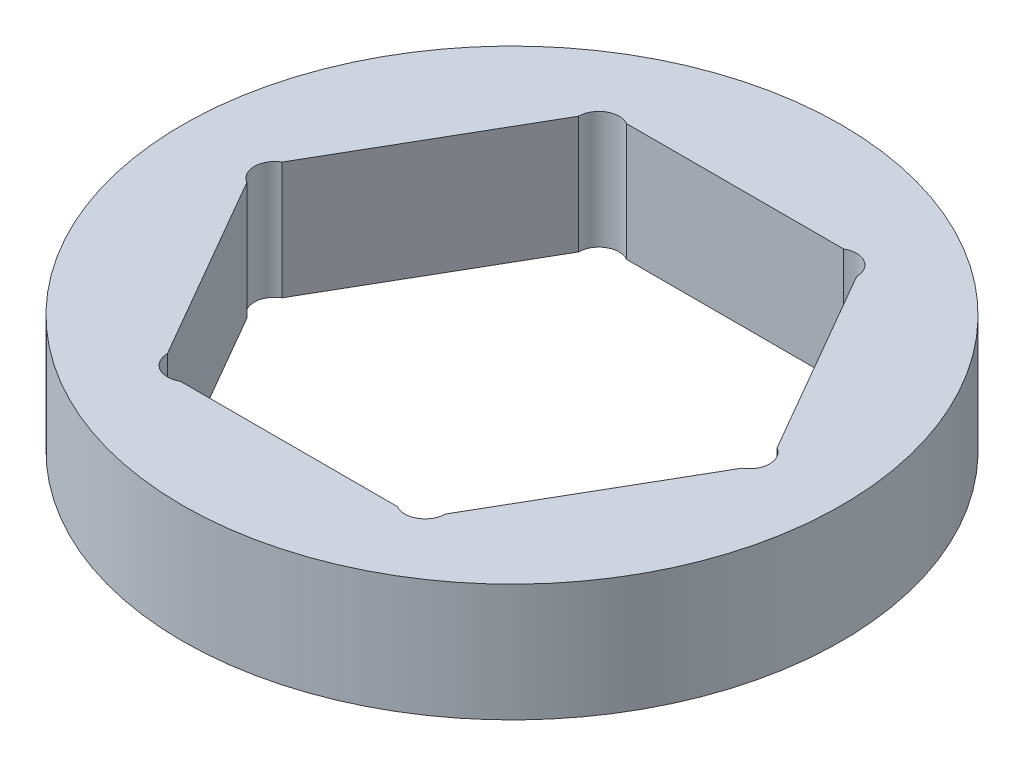
ISO-10303-21;
HEADER;
FILE_DESCRIPTION(('STEP AP214'),'2;1');
FILE_NAME('part.step','',(''),(''),'','','');
FILE_SCHEMA(('AUTOMOTIVE_DESIGN { 1 0 10303 214 1 1 1 1 }'));
ENDSEC;
DATA;
#1=APPLICATION_CONTEXT('core data for automotive mechanical design processes');
#2=APPLICATION_PROTOCOL_DEFINITION('international standard','automotive_design',2000,#1);
#3=PRODUCT_CONTEXT('',#1,'mechanical');
#4=PRODUCT('Part','Part','',(#3));
#5=PRODUCT_RELATED_PRODUCT_CATEGORY('part','',(#4));
#6=PRODUCT_DEFINITION_FORMATION('','',#4);
#7=PRODUCT_DEFINITION_CONTEXT('part definition',#1,'design');
#8=PRODUCT_DEFINITION('design','',#6,#7);
#9=PRODUCT_DEFINITION_SHAPE('','',#8);
#10=(LENGTH_UNIT() NAMED_UNIT(*) SI_UNIT(.MILLI.,.METRE.));
#11=(NAMED_UNIT(*) PLANE_ANGLE_UNIT() SI_UNIT($,.RADIAN.));
#12=(NAMED_UNIT(*) SI_UNIT($,.STERADIAN.) SOLID_ANGLE_UNIT());
#13=UNCERTAINTY_MEASURE_WITH_UNIT(LENGTH_MEASURE(1.E-05),#10,'distance_accuracy_value','');
#14=(GEOMETRIC_REPRESENTATION_CONTEXT(3) GLOBAL_UNCERTAINTY_ASSIGNED_CONTEXT((#13)) GLOBAL_UNIT_ASSIGNED_CONTEXT((#10,
#11,#12)) REPRESENTATION_CONTEXT('',''));
#15=CARTESIAN_POINT('',(0.,0.,0.));
#16=DIRECTION('',(0.,0.,1.));
#17=DIRECTION('',(1.,0.,0.));
#18=AXIS2_PLACEMENT_3D('',#15,#16,#17);
#19=CARTESIAN_POINT('',(-3.5128211777283,3.4798,-6.08438475772933));
#20=DIRECTION('',(0.,-1.,0.));
#21=DIRECTION('',(0.,0.,-1.));
#22=AXIS2_PLACEMENT_3D('',#19,#20,#21);
#23=CYLINDRICAL_SURFACE('',#22,0.600000000000001);
#24=CARTESIAN_POINT('',(-3.5128211777283,0.,-6.08438475772933));
#25=DIRECTION('',(0.,1.,0.));
#26=DIRECTION('',(0.,0.,1.));
#27=AXIS2_PLACEMENT_3D('',#24,#25,#26);
#28=CIRCLE('',#27,0.600000000000001);
#29=CARTESIAN_POINT('',(-3.2128211777283,0.,-6.604));
#30=VERTEX_POINT('',#29);
#31=CARTESIAN_POINT('',(-4.1128211777283,0.,-6.08438475772932));
#32=VERTEX_POINT('',#31);
#33=EDGE_CURVE('E162',#30,#32,#28,.T.);
#34=ORIENTED_EDGE('',*,*,#33,.F.);
#35=DIRECTION('',(0.,-1.,0.));
#36=VECTOR('',#35,1.);
#37=CARTESIAN_POINT('',(-3.2128211777283,3.4798,-6.604));
#38=LINE('',#37,#36);
#39=CARTESIAN_POINT('',(-3.2128211777283,3.4798,-6.604));
#40=VERTEX_POINT('',#39);
#41=EDGE_CURVE('E11',#40,#30,#38,.T.);
#42=ORIENTED_EDGE('',*,*,#41,.F.);
#43=CARTESIAN_POINT('',(-3.5128211777283,3.4798,-6.08438475772933));
#44=DIRECTION('',(0.,1.,0.));
#45=DIRECTION('',(0.,0.,1.));
#46=AXIS2_PLACEMENT_3D('',#43,#44,#45);
#47=CIRCLE('',#46,0.600000000000001);
#48=CARTESIAN_POINT('',(-4.1128211777283,3.4798,-6.08438475772932));
#49=VERTEX_POINT('',#48);
#50=EDGE_CURVE('E197',#40,#49,#47,.T.);
#51=ORIENTED_EDGE('',*,*,#50,.T.);
#52=DIRECTION('',(0.,-1.,0.));
#53=VECTOR('',#52,1.);
#54=CARTESIAN_POINT('',(-4.1128211777283,3.4798,-6.08438475772932));
#55=LINE('',#54,#53);
#56=EDGE_CURVE('E57',#49,#32,#55,.T.);
#57=ORIENTED_EDGE('',*,*,#56,.T.);
#58=EDGE_LOOP('',(#34,#42,#51,#57));
#59=FACE_BOUND('',#58,.T.);
#60=ADVANCED_FACE('F41',(#59),#23,.F.);
#61=CARTESIAN_POINT('',(0.,3.4798,-6.604));
#62=DIRECTION('',(0.,0.,1.));
#63=DIRECTION('',(1.,0.,0.));
#64=AXIS2_PLACEMENT_3D('',#61,#62,#63);
#65=PLANE('',#64);
#66=DIRECTION('',(-1.,0.,0.));
#67=VECTOR('',#66,1.);
#68=CARTESIAN_POINT('',(0.,0.,-6.604));
#69=LINE('',#68,#67);
#70=CARTESIAN_POINT('',(3.21282117772828,0.,-6.604));
#71=VERTEX_POINT('',#70);
#72=EDGE_CURVE('E164',#71,#30,#69,.T.);
#73=ORIENTED_EDGE('',*,*,#72,.F.);
#74=DIRECTION('',(0.,-1.,0.));
#75=VECTOR('',#74,1.);
#76=CARTESIAN_POINT('',(3.21282117772828,3.4798,-6.604));
#77=LINE('',#76,#75);
#78=CARTESIAN_POINT('',(3.21282117772828,3.4798,-6.604));
#79=VERTEX_POINT('',#78);
#80=EDGE_CURVE('E49',#79,#71,#77,.T.);
#81=ORIENTED_EDGE('',*,*,#80,.F.);
#82=DIRECTION('',(-1.,0.,0.));
#83=VECTOR('',#82,1.);
#84=CARTESIAN_POINT('',(0.,3.4798,-6.604));
#85=LINE('',#84,#83);
#86=EDGE_CURVE('E235',#79,#40,#85,.T.);
#87=ORIENTED_EDGE('',*,*,#86,.T.);
#88=ORIENTED_EDGE('',*,*,#41,.T.);
#89=EDGE_LOOP('',(#73,#81,#87,#88));
#90=FACE_BOUND('',#89,.T.);
#91=ADVANCED_FACE('F222',(#90),#65,.T.);
#92=CARTESIAN_POINT('',(3.51282117772829,3.4798,-6.08438475772934));
#93=DIRECTION('',(0.,-1.,0.));
#94=DIRECTION('',(0.,0.,-1.));
#95=AXIS2_PLACEMENT_3D('',#92,#93,#94);
#96=CYLINDRICAL_SURFACE('',#95,0.600000000000001);
#97=CARTESIAN_POINT('',(3.51282117772829,0.,-6.08438475772934));
#98=DIRECTION('',(0.,1.,0.));
#99=DIRECTION('',(0.,0.,1.));
#100=AXIS2_PLACEMENT_3D('',#97,#98,#99);
#101=CIRCLE('',#100,0.600000000000001);
#102=CARTESIAN_POINT('',(4.11282117772829,0.,-6.08438475772934));
#103=VERTEX_POINT('',#102);
#104=EDGE_CURVE('E167',#103,#71,#101,.T.);
#105=ORIENTED_EDGE('',*,*,#104,.F.);
#106=DIRECTION('',(0.,-1.,0.));
#107=VECTOR('',#106,1.);
#108=CARTESIAN_POINT('',(4.11282117772829,3.4798,-6.08438475772934));
#109=LINE('',#108,#107);
#110=CARTESIAN_POINT('',(4.11282117772829,3.4798,-6.08438475772934));
#111=VERTEX_POINT('',#110);
#112=EDGE_CURVE('E211',#111,#103,#109,.T.);
#113=ORIENTED_EDGE('',*,*,#112,.F.);
#114=CARTESIAN_POINT('',(3.51282117772829,3.4798,-6.08438475772934));
#115=DIRECTION('',(0.,1.,0.));
#116=DIRECTION('',(0.,0.,1.));
#117=AXIS2_PLACEMENT_3D('',#114,#115,#116);
#118=CIRCLE('',#117,0.600000000000001);
#119=EDGE_CURVE('E218',#111,#79,#118,.T.);
#120=ORIENTED_EDGE('',*,*,#119,.T.);
#121=ORIENTED_EDGE('',*,*,#80,.T.);
#122=EDGE_LOOP('',(#105,#113,#120,#121));
#123=FACE_BOUND('',#122,.T.);
#124=ADVANCED_FACE('F216',(#123),#96,.F.);
#125=CARTESIAN_POINT('',(5.71923176659243,3.4798,-3.302));
#126=DIRECTION('',(-0.866025403784438,0.,0.5));
#127=DIRECTION('',(0.5,0.,0.866025403784439));
#128=AXIS2_PLACEMENT_3D('',#125,#126,#127);
#129=PLANE('',#128);
#130=DIRECTION('',(-0.5,0.,-0.866025403784438));
#131=VECTOR('',#130,1.);
#132=CARTESIAN_POINT('',(5.71923176659243,0.,-3.302));
#133=LINE('',#132,#131);
#134=CARTESIAN_POINT('',(7.32564235545658,0.,-0.519615242270668));
#135=VERTEX_POINT('',#134);
#136=EDGE_CURVE('E170',#135,#103,#133,.T.);
#137=ORIENTED_EDGE('',*,*,#136,.F.);
#138=DIRECTION('',(0.,-1.,0.));
#139=VECTOR('',#138,1.);
#140=CARTESIAN_POINT('',(7.32564235545658,3.4798,-0.519615242270668));
#141=LINE('',#140,#139);
#142=CARTESIAN_POINT('',(7.32564235545658,3.4798,-0.519615242270668));
#143=VERTEX_POINT('',#142);
#144=EDGE_CURVE('E209',#143,#135,#141,.T.);
#145=ORIENTED_EDGE('',*,*,#144,.F.);
#146=DIRECTION('',(-0.5,0.,-0.866025403784438));
#147=VECTOR('',#146,1.);
#148=CARTESIAN_POINT('',(5.71923176659243,3.4798,-3.302));
#149=LINE('',#148,#147);
#150=EDGE_CURVE('E232',#143,#111,#149,.T.);
#151=ORIENTED_EDGE('',*,*,#150,.T.);
#152=ORIENTED_EDGE('',*,*,#112,.T.);
#153=EDGE_LOOP('',(#137,#145,#151,#152));
#154=FACE_BOUND('',#153,.T.);
#155=ADVANCED_FACE('F229',(#154),#129,.T.);
#156=CARTESIAN_POINT('',(7.02564235545658,3.4798,0.));
#157=DIRECTION('',(0.,-1.,0.));
#158=DIRECTION('',(0.,0.,-1.));
#159=AXIS2_PLACEMENT_3D('',#156,#157,#158);
#160=CYLINDRICAL_SURFACE('',#159,0.6);
#161=CARTESIAN_POINT('',(7.02564235545658,0.,0.));
#162=DIRECTION('',(0.,1.,0.));
#163=DIRECTION('',(0.,0.,1.));
#164=AXIS2_PLACEMENT_3D('',#161,#162,#163);
#165=CIRCLE('',#164,0.6);
#166=CARTESIAN_POINT('',(7.32564235545658,0.,0.519615242270659));
#167=VERTEX_POINT('',#166);
#168=EDGE_CURVE('E173',#167,#135,#165,.T.);
#169=ORIENTED_EDGE('',*,*,#168,.F.);
#170=DIRECTION('',(0.,-1.,0.));
#171=VECTOR('',#170,1.);
#172=CARTESIAN_POINT('',(7.32564235545658,3.4798,0.519615242270659));
#173=LINE('',#172,#171);
#174=CARTESIAN_POINT('',(7.32564235545658,3.4798,0.519615242270659));
#175=VERTEX_POINT('',#174);
#176=EDGE_CURVE('E207',#175,#167,#173,.T.);
#177=ORIENTED_EDGE('',*,*,#176,.F.);
#178=CARTESIAN_POINT('',(7.02564235545658,3.4798,0.));
#179=DIRECTION('',(0.,1.,0.));
#180=DIRECTION('',(0.,0.,1.));
#181=AXIS2_PLACEMENT_3D('',#178,#179,#180);
#182=CIRCLE('',#181,0.6);
#183=EDGE_CURVE('E237',#175,#143,#182,.T.);
#184=ORIENTED_EDGE('',*,*,#183,.T.);
#185=ORIENTED_EDGE('',*,*,#144,.T.);
#186=EDGE_LOOP('',(#169,#177,#184,#185));
#187=FACE_BOUND('',#186,.T.);
#188=ADVANCED_FACE('F277',(#187),#160,.F.);
#189=CARTESIAN_POINT('',(5.71923176659244,3.4798,3.302));
#190=DIRECTION('',(-0.866025403784439,0.,-0.499999999999999));
#191=DIRECTION('',(-0.499999999999999,0.,0.866025403784439));
#192=AXIS2_PLACEMENT_3D('',#189,#190,#191);
#193=PLANE('',#192);
#194=DIRECTION('',(0.499999999999999,0.,-0.866025403784439));
#195=VECTOR('',#194,1.);
#196=CARTESIAN_POINT('',(5.71923176659244,0.,3.302));
#197=LINE('',#196,#195);
#198=CARTESIAN_POINT('',(4.11282117772829,0.,6.08438475772933));
#199=VERTEX_POINT('',#198);
#200=EDGE_CURVE('E176',#199,#167,#197,.T.);
#201=ORIENTED_EDGE('',*,*,#200,.F.);
#202=DIRECTION('',(0.,-1.,0.));
#203=VECTOR('',#202,1.);
#204=CARTESIAN_POINT('',(4.11282117772829,3.4798,6.08438475772933));
#205=LINE('',#204,#203);
#206=CARTESIAN_POINT('',(4.11282117772829,3.4798,6.08438475772933));
#207=VERTEX_POINT('',#206);
#208=EDGE_CURVE('E205',#207,#199,#205,.T.);
#209=ORIENTED_EDGE('',*,*,#208,.F.);
#210=DIRECTION('',(0.499999999999999,0.,-0.866025403784439));
#211=VECTOR('',#210,1.);
#212=CARTESIAN_POINT('',(5.71923176659244,3.4798,3.302));
#213=LINE('',#212,#211);
#214=EDGE_CURVE('E243',#207,#175,#213,.T.);
#215=ORIENTED_EDGE('',*,*,#214,.T.);
#216=ORIENTED_EDGE('',*,*,#176,.T.);
#217=EDGE_LOOP('',(#201,#209,#215,#216));
#218=FACE_BOUND('',#217,.T.);
#219=ADVANCED_FACE('F280',(#218),#193,.T.);
#220=CARTESIAN_POINT('',(3.51282117772829,3.4798,6.08438475772933));
#221=DIRECTION('',(0.,-1.,0.));
#222=DIRECTION('',(0.,0.,-1.));
#223=AXIS2_PLACEMENT_3D('',#220,#221,#222);
#224=CYLINDRICAL_SURFACE('',#223,0.600000000000001);
#225=CARTESIAN_POINT('',(3.51282117772829,0.,6.08438475772933));
#226=DIRECTION('',(0.,1.,0.));
#227=DIRECTION('',(0.,0.,1.));
#228=AXIS2_PLACEMENT_3D('',#225,#226,#227);
#229=CIRCLE('',#228,0.600000000000001);
#230=CARTESIAN_POINT('',(3.21282117772829,0.,6.604));
#231=VERTEX_POINT('',#230);
#232=EDGE_CURVE('E179',#231,#199,#229,.T.);
#233=ORIENTED_EDGE('',*,*,#232,.F.);
#234=DIRECTION('',(0.,-1.,0.));
#235=VECTOR('',#234,1.);
#236=CARTESIAN_POINT('',(3.21282117772829,3.4798,6.604));
#237=LINE('',#236,#235);
#238=CARTESIAN_POINT('',(3.21282117772829,3.4798,6.604));
#239=VERTEX_POINT('',#238);
#240=EDGE_CURVE('E203',#239,#231,#237,.T.);
#241=ORIENTED_EDGE('',*,*,#240,.F.);
#242=CARTESIAN_POINT('',(3.51282117772829,3.4798,6.08438475772933));
#243=DIRECTION('',(0.,1.,0.));
#244=DIRECTION('',(0.,0.,1.));
#245=AXIS2_PLACEMENT_3D('',#242,#243,#244);
#246=CIRCLE('',#245,0.600000000000001);
#247=EDGE_CURVE('E246',#239,#207,#246,.T.);
#248=ORIENTED_EDGE('',*,*,#247,.T.);
#249=ORIENTED_EDGE('',*,*,#208,.T.);
#250=EDGE_LOOP('',(#233,#241,#248,#249));
#251=FACE_BOUND('',#250,.T.);
#252=ADVANCED_FACE('F284',(#251),#224,.F.);
#253=CARTESIAN_POINT('',(0.,3.4798,6.604));
#254=DIRECTION('',(0.,0.,-1.));
#255=DIRECTION('',(-1.,0.,0.));
#256=AXIS2_PLACEMENT_3D('',#253,#254,#255);
#257=PLANE('',#256);
#258=DIRECTION('',(1.,0.,0.));
#259=VECTOR('',#258,1.);
#260=CARTESIAN_POINT('',(0.,0.,6.604));
#261=LINE('',#260,#259);
#262=CARTESIAN_POINT('',(-3.21282117772829,0.,6.604));
#263=VERTEX_POINT('',#262);
#264=EDGE_CURVE('E182',#263,#231,#261,.T.);
#265=ORIENTED_EDGE('',*,*,#264,.F.);
#266=DIRECTION('',(0.,-1.,0.));
#267=VECTOR('',#266,1.);
#268=CARTESIAN_POINT('',(-3.21282117772829,3.4798,6.604));
#269=LINE('',#268,#267);
#270=CARTESIAN_POINT('',(-3.21282117772829,3.4798,6.604));
#271=VERTEX_POINT('',#270);
#272=EDGE_CURVE('E201',#271,#263,#269,.T.);
#273=ORIENTED_EDGE('',*,*,#272,.F.);
#274=DIRECTION('',(1.,0.,0.));
#275=VECTOR('',#274,1.);
#276=CARTESIAN_POINT('',(0.,3.4798,6.604));
#277=LINE('',#276,#275);
#278=EDGE_CURVE('E249',#271,#239,#277,.T.);
#279=ORIENTED_EDGE('',*,*,#278,.T.);
#280=ORIENTED_EDGE('',*,*,#240,.T.);
#281=EDGE_LOOP('',(#265,#273,#279,#280));
#282=FACE_BOUND('',#281,.T.);
#283=ADVANCED_FACE('F288',(#282),#257,.T.);
#284=CARTESIAN_POINT('',(-3.51282117772829,3.4798,6.08438475772934));
#285=DIRECTION('',(0.,-1.,0.));
#286=DIRECTION('',(0.,0.,-1.));
#287=AXIS2_PLACEMENT_3D('',#284,#285,#286);
#288=CYLINDRICAL_SURFACE('',#287,0.6);
#289=CARTESIAN_POINT('',(-3.51282117772829,0.,6.08438475772934));
#290=DIRECTION('',(0.,1.,0.));
#291=DIRECTION('',(0.,0.,1.));
#292=AXIS2_PLACEMENT_3D('',#289,#290,#291);
#293=CIRCLE('',#292,0.6);
#294=CARTESIAN_POINT('',(-4.11282117772828,0.,6.08438475772934));
#295=VERTEX_POINT('',#294);
#296=EDGE_CURVE('E185',#295,#263,#293,.T.);
#297=ORIENTED_EDGE('',*,*,#296,.F.);
#298=DIRECTION('',(0.,-1.,0.));
#299=VECTOR('',#298,1.);
#300=CARTESIAN_POINT('',(-4.11282117772828,3.4798,6.08438475772934));
#301=LINE('',#300,#299);
#302=CARTESIAN_POINT('',(-4.11282117772828,3.4798,6.08438475772934));
#303=VERTEX_POINT('',#302);
#304=EDGE_CURVE('E140',#303,#295,#301,.T.);
#305=ORIENTED_EDGE('',*,*,#304,.F.);
#306=CARTESIAN_POINT('',(-3.51282117772829,3.4798,6.08438475772934));
#307=DIRECTION('',(0.,1.,0.));
#308=DIRECTION('',(0.,0.,1.));
#309=AXIS2_PLACEMENT_3D('',#306,#307,#308);
#310=CIRCLE('',#309,0.6);
#311=EDGE_CURVE('E151',#303,#271,#310,.T.);
#312=ORIENTED_EDGE('',*,*,#311,.T.);
#313=ORIENTED_EDGE('',*,*,#272,.T.);
#314=EDGE_LOOP('',(#297,#305,#312,#313));
#315=FACE_BOUND('',#314,.T.);
#316=ADVANCED_FACE('F253',(#315),#288,.F.);
#317=CARTESIAN_POINT('',(-5.71923176659243,3.4798,3.302));
#318=DIRECTION('',(0.866025403784438,0.,-0.500000000000001));
#319=DIRECTION('',(-0.500000000000001,0.,-0.866025403784438));
#320=AXIS2_PLACEMENT_3D('',#317,#318,#319);
#321=PLANE('',#320);
#322=DIRECTION('',(0.500000000000001,0.,0.866025403784438));
#323=VECTOR('',#322,1.);
#324=CARTESIAN_POINT('',(-5.71923176659243,0.,3.302));
#325=LINE('',#324,#323);
#326=CARTESIAN_POINT('',(-7.32564235545657,0.,0.519615242270671));
#327=VERTEX_POINT('',#326);
#328=EDGE_CURVE('E136',#327,#295,#325,.T.);
#329=ORIENTED_EDGE('',*,*,#328,.F.);
#330=DIRECTION('',(0.,-1.,0.));
#331=VECTOR('',#330,1.);
#332=CARTESIAN_POINT('',(-7.32564235545657,3.4798,0.519615242270671));
#333=LINE('',#332,#331);
#334=CARTESIAN_POINT('',(-7.32564235545657,3.4798,0.519615242270671));
#335=VERTEX_POINT('',#334);
#336=EDGE_CURVE('E131',#335,#327,#333,.T.);
#337=ORIENTED_EDGE('',*,*,#336,.F.);
#338=DIRECTION('',(0.500000000000001,0.,0.866025403784438));
#339=VECTOR('',#338,1.);
#340=CARTESIAN_POINT('',(-5.71923176659243,3.4798,3.302));
#341=LINE('',#340,#339);
#342=EDGE_CURVE('E134',#335,#303,#341,.T.);
#343=ORIENTED_EDGE('',*,*,#342,.T.);
#344=ORIENTED_EDGE('',*,*,#304,.T.);
#345=EDGE_LOOP('',(#329,#337,#343,#344));
#346=FACE_BOUND('',#345,.T.);
#347=ADVANCED_FACE('F133',(#346),#321,.T.);
#348=CARTESIAN_POINT('',(-7.02564235545658,3.4798,0.));
#349=DIRECTION('',(0.,-1.,0.));
#350=DIRECTION('',(0.,0.,-1.));
#351=AXIS2_PLACEMENT_3D('',#348,#349,#350);
#352=CYLINDRICAL_SURFACE('',#351,0.6);
#353=CARTESIAN_POINT('',(-7.02564235545658,0.,0.));
#354=DIRECTION('',(0.,1.,0.));
#355=DIRECTION('',(0.,0.,1.));
#356=AXIS2_PLACEMENT_3D('',#353,#354,#355);
#357=CIRCLE('',#356,0.6);
#358=CARTESIAN_POINT('',(-7.32564235545658,0.,-0.519615242270657));
#359=VERTEX_POINT('',#358);
#360=EDGE_CURVE('E189',#359,#327,#357,.T.);
#361=ORIENTED_EDGE('',*,*,#360,.F.);
#362=DIRECTION('',(0.,-1.,0.));
#363=VECTOR('',#362,1.);
#364=CARTESIAN_POINT('',(-7.32564235545658,3.4798,-0.519615242270657));
#365=LINE('',#364,#363);
#366=CARTESIAN_POINT('',(-7.32564235545658,3.4798,-0.519615242270657));
#367=VERTEX_POINT('',#366);
#368=EDGE_CURVE('E94',#367,#359,#365,.T.);
#369=ORIENTED_EDGE('',*,*,#368,.F.);
#370=CARTESIAN_POINT('',(-7.02564235545658,3.4798,0.));
#371=DIRECTION('',(0.,1.,0.));
#372=DIRECTION('',(0.,0.,1.));
#373=AXIS2_PLACEMENT_3D('',#370,#371,#372);
#374=CIRCLE('',#373,0.6);
#375=EDGE_CURVE('E148',#367,#335,#374,.T.);
#376=ORIENTED_EDGE('',*,*,#375,.T.);
#377=ORIENTED_EDGE('',*,*,#336,.T.);
#378=EDGE_LOOP('',(#361,#369,#376,#377));
#379=FACE_BOUND('',#378,.T.);
#380=ADVANCED_FACE('F153',(#379),#352,.F.);
#381=CARTESIAN_POINT('',(-5.71923176659243,3.4798,-3.302));
#382=DIRECTION('',(0.866025403784439,0.,0.5));
#383=DIRECTION('',(0.5,0.,-0.866025403784439));
#384=AXIS2_PLACEMENT_3D('',#381,#382,#383);
#385=PLANE('',#384);
#386=DIRECTION('',(-0.5,0.,0.866025403784439));
#387=VECTOR('',#386,1.);
#388=CARTESIAN_POINT('',(-5.71923176659243,0.,-3.302));
#389=LINE('',#388,#387);
#390=EDGE_CURVE('E191',#32,#359,#389,.T.);
#391=ORIENTED_EDGE('',*,*,#390,.F.);
#392=ORIENTED_EDGE('',*,*,#56,.F.);
#393=DIRECTION('',(-0.5,0.,0.866025403784439));
#394=VECTOR('',#393,1.);
#395=CARTESIAN_POINT('',(-5.71923176659243,3.4798,-3.302));
#396=LINE('',#395,#394);
#397=EDGE_CURVE('E154',#49,#367,#396,.T.);
#398=ORIENTED_EDGE('',*,*,#397,.T.);
#399=ORIENTED_EDGE('',*,*,#368,.T.);
#400=EDGE_LOOP('',(#391,#392,#398,#399));
#401=FACE_BOUND('',#400,.T.);
#402=ADVANCED_FACE('F255',(#401),#385,.T.);
#403=CARTESIAN_POINT('',(0.,3.4798,0.));
#404=DIRECTION('',(0.,-1.,0.));
#405=DIRECTION('',(0.,0.,-1.));
#406=AXIS2_PLACEMENT_3D('',#403,#404,#405);
#407=CYLINDRICAL_SURFACE('',#406,9.7536);
#408=CARTESIAN_POINT('',(0.,3.4798,0.));
#409=DIRECTION('',(0.,1.,0.));
#410=DIRECTION('',(0.,0.,1.));
#411=AXIS2_PLACEMENT_3D('',#408,#409,#410);
#412=CIRCLE('',#411,9.7536);
#413=CARTESIAN_POINT('',(0.,3.4798,9.7536));
#414=VERTEX_POINT('',#413);
#415=EDGE_CURVE('E156',#414,#414,#412,.T.);
#416=ORIENTED_EDGE('',*,*,#415,.F.);
#417=EDGE_LOOP('',(#416));
#418=FACE_BOUND('',#417,.T.);
#419=CARTESIAN_POINT('',(0.,0.,0.));
#420=DIRECTION('',(0.,1.,0.));
#421=DIRECTION('',(0.,0.,1.));
#422=AXIS2_PLACEMENT_3D('',#419,#420,#421);
#423=CIRCLE('',#422,9.7536);
#424=CARTESIAN_POINT('',(0.,0.,9.7536));
#425=VERTEX_POINT('',#424);
#426=EDGE_CURVE('E194',#425,#425,#423,.T.);
#427=ORIENTED_EDGE('',*,*,#426,.T.);
#428=EDGE_LOOP('',(#427));
#429=FACE_BOUND('',#428,.T.);
#430=ADVANCED_FACE('F257',(#418,#429),#407,.T.);
#431=CARTESIAN_POINT('',(0.,3.4798,0.));
#432=DIRECTION('',(0.,1.,0.));
#433=DIRECTION('',(0.,0.,1.));
#434=AXIS2_PLACEMENT_3D('',#431,#432,#433);
#435=PLANE('',#434);
#436=ORIENTED_EDGE('',*,*,#50,.F.);
#437=ORIENTED_EDGE('',*,*,#86,.F.);
#438=ORIENTED_EDGE('',*,*,#119,.F.);
#439=ORIENTED_EDGE('',*,*,#150,.F.);
#440=ORIENTED_EDGE('',*,*,#183,.F.);
#441=ORIENTED_EDGE('',*,*,#214,.F.);
#442=ORIENTED_EDGE('',*,*,#247,.F.);
#443=ORIENTED_EDGE('',*,*,#278,.F.);
#444=ORIENTED_EDGE('',*,*,#311,.F.);
#445=ORIENTED_EDGE('',*,*,#342,.F.);
#446=ORIENTED_EDGE('',*,*,#375,.F.);
#447=ORIENTED_EDGE('',*,*,#397,.F.);
#448=EDGE_LOOP('',(#436,#437,#438,#439,#440,#441,#442,#443,#444,#445,#446,#447));
#449=FACE_BOUND('',#448,.T.);
#450=ORIENTED_EDGE('',*,*,#415,.T.);
#451=EDGE_LOOP('',(#450));
#452=FACE_BOUND('',#451,.T.);
#453=ADVANCED_FACE('F145',(#449,#452),#435,.T.);
#454=CARTESIAN_POINT('',(0.,0.,0.));
#455=DIRECTION('',(0.,1.,0.));
#456=DIRECTION('',(0.,0.,1.));
#457=AXIS2_PLACEMENT_3D('',#454,#455,#456);
#458=PLANE('',#457);
#459=ORIENTED_EDGE('',*,*,#33,.T.);
#460=ORIENTED_EDGE('',*,*,#390,.T.);
#461=ORIENTED_EDGE('',*,*,#360,.T.);
#462=ORIENTED_EDGE('',*,*,#328,.T.);
#463=ORIENTED_EDGE('',*,*,#296,.T.);
#464=ORIENTED_EDGE('',*,*,#264,.T.);
#465=ORIENTED_EDGE('',*,*,#232,.T.);
#466=ORIENTED_EDGE('',*,*,#200,.T.);
#467=ORIENTED_EDGE('',*,*,#168,.T.);
#468=ORIENTED_EDGE('',*,*,#136,.T.);
#469=ORIENTED_EDGE('',*,*,#104,.T.);
#470=ORIENTED_EDGE('',*,*,#72,.T.);
#471=EDGE_LOOP('',(#459,#460,#461,#462,#463,#464,#465,#466,#467,#468,#469,#470));
#472=FACE_BOUND('',#471,.T.);
#473=ORIENTED_EDGE('',*,*,#426,.F.);
#474=EDGE_LOOP('',(#473));
#475=FACE_BOUND('',#474,.T.);
#476=ADVANCED_FACE('F224',(#472,#475),#458,.F.);
#477=CLOSED_SHELL('',(#60,#91,#124,#155,#188,#219,#252,#283,#316,#347,#380,#402,#430,#453,#476));
#478=MANIFOLD_SOLID_BREP('B2',#477);
#479=ADVANCED_BREP_SHAPE_REPRESENTATION('',(#18,#478),#14);
#480=SHAPE_DEFINITION_REPRESENTATION(#9,#479);
ENDSEC;
END-ISO-10303-21;
